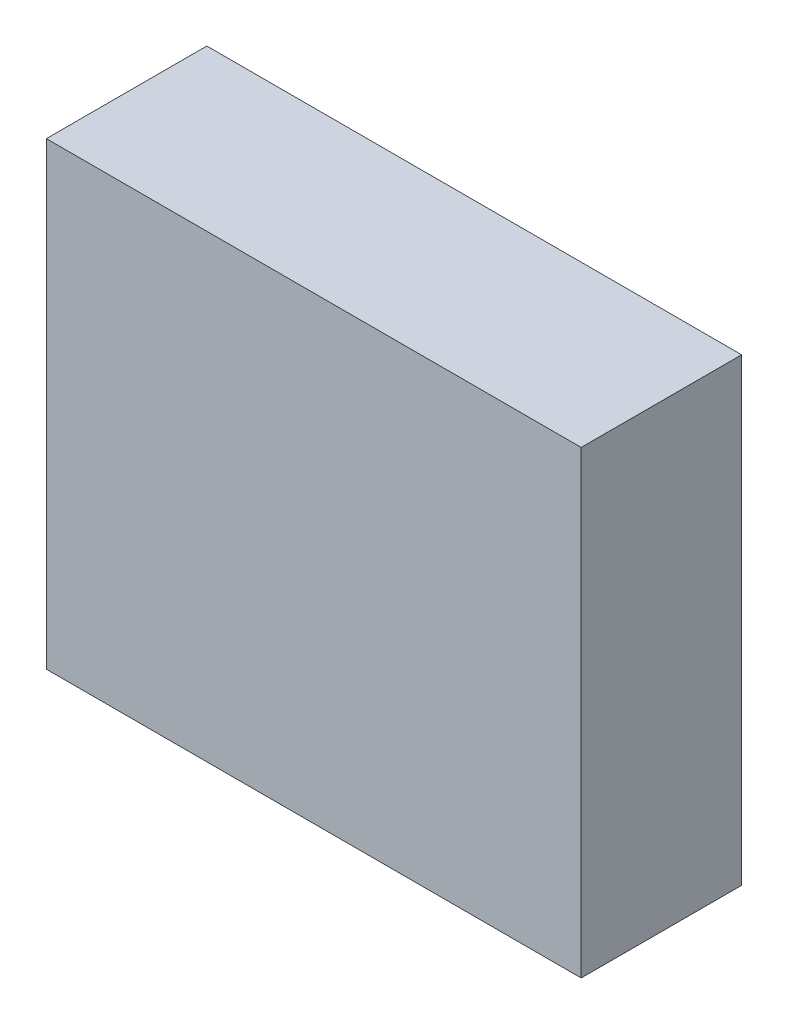
ISO-10303-21;
HEADER;
FILE_DESCRIPTION(('STEP AP214'),'2;1');
FILE_NAME('part.step','',(''),(''),'','','');
FILE_SCHEMA(('AUTOMOTIVE_DESIGN { 1 0 10303 214 1 1 1 1 }'));
ENDSEC;
DATA;
#1=APPLICATION_CONTEXT('core data for automotive mechanical design processes');
#2=APPLICATION_PROTOCOL_DEFINITION('international standard','automotive_design',2000,#1);
#3=PRODUCT_CONTEXT('',#1,'mechanical');
#4=PRODUCT('Part','Part','',(#3));
#5=PRODUCT_RELATED_PRODUCT_CATEGORY('part','',(#4));
#6=PRODUCT_DEFINITION_FORMATION('','',#4);
#7=PRODUCT_DEFINITION_CONTEXT('part definition',#1,'design');
#8=PRODUCT_DEFINITION('design','',#6,#7);
#9=PRODUCT_DEFINITION_SHAPE('','',#8);
#10=(LENGTH_UNIT() NAMED_UNIT(*) SI_UNIT(.MILLI.,.METRE.));
#11=(NAMED_UNIT(*) PLANE_ANGLE_UNIT() SI_UNIT($,.RADIAN.));
#12=(NAMED_UNIT(*) SI_UNIT($,.STERADIAN.) SOLID_ANGLE_UNIT());
#13=UNCERTAINTY_MEASURE_WITH_UNIT(LENGTH_MEASURE(1.E-05),#10,'distance_accuracy_value','');
#14=(GEOMETRIC_REPRESENTATION_CONTEXT(3) GLOBAL_UNCERTAINTY_ASSIGNED_CONTEXT((#13)) GLOBAL_UNIT_ASSIGNED_CONTEXT((#10,
#11,#12)) REPRESENTATION_CONTEXT('',''));
#15=CARTESIAN_POINT('',(0.,0.,0.));
#16=DIRECTION('',(0.,0.,1.));
#17=DIRECTION('',(1.,0.,0.));
#18=AXIS2_PLACEMENT_3D('',#15,#16,#17);
#19=CARTESIAN_POINT('',(3.5500056,-3.0499812,2.1299932));
#20=DIRECTION('',(0.,1.,0.));
#21=DIRECTION('',(0.,0.,1.));
#22=AXIS2_PLACEMENT_3D('',#19,#20,#21);
#23=PLANE('',#22);
#24=DIRECTION('',(1.,0.,0.));
#25=VECTOR('',#24,1.);
#26=CARTESIAN_POINT('',(3.5500056,-3.0499812,0.));
#27=LINE('',#26,#25);
#28=CARTESIAN_POINT('',(-3.5500056,-3.0499812,0.));
#29=VERTEX_POINT('',#28);
#30=CARTESIAN_POINT('',(3.5500056,-3.0499812,0.));
#31=VERTEX_POINT('',#30);
#32=EDGE_CURVE('E95',#29,#31,#27,.T.);
#33=ORIENTED_EDGE('',*,*,#32,.T.);
#34=DIRECTION('',(0.,0.,-1.));
#35=VECTOR('',#34,1.);
#36=CARTESIAN_POINT('',(3.5500056,-3.0499812,2.1299932));
#37=LINE('',#36,#35);
#38=CARTESIAN_POINT('',(3.5500056,-3.0499812,2.1299932));
#39=VERTEX_POINT('',#38);
#40=EDGE_CURVE('E11',#39,#31,#37,.T.);
#41=ORIENTED_EDGE('',*,*,#40,.F.);
#42=DIRECTION('',(1.,0.,0.));
#43=VECTOR('',#42,1.);
#44=CARTESIAN_POINT('',(3.5500056,-3.0499812,2.1299932));
#45=LINE('',#44,#43);
#46=CARTESIAN_POINT('',(-3.5500056,-3.0499812,2.1299932));
#47=VERTEX_POINT('',#46);
#48=EDGE_CURVE('E83',#47,#39,#45,.T.);
#49=ORIENTED_EDGE('',*,*,#48,.F.);
#50=DIRECTION('',(0.,0.,-1.));
#51=VECTOR('',#50,1.);
#52=CARTESIAN_POINT('',(-3.5500056,-3.0499812,2.1299932));
#53=LINE('',#52,#51);
#54=EDGE_CURVE('E91',#47,#29,#53,.T.);
#55=ORIENTED_EDGE('',*,*,#54,.T.);
#56=EDGE_LOOP('',(#33,#41,#49,#55));
#57=FACE_BOUND('',#56,.T.);
#58=ADVANCED_FACE('F32',(#57),#23,.F.);
#59=CARTESIAN_POINT('',(3.5500056,3.0500066,2.1299932));
#60=DIRECTION('',(-1.,0.,0.));
#61=DIRECTION('',(0.,0.,1.));
#62=AXIS2_PLACEMENT_3D('',#59,#60,#61);
#63=PLANE('',#62);
#64=DIRECTION('',(0.,1.,0.));
#65=VECTOR('',#64,1.);
#66=CARTESIAN_POINT('',(3.5500056,3.0500066,0.));
#67=LINE('',#66,#65);
#68=CARTESIAN_POINT('',(3.5500056,3.0500066,0.));
#69=VERTEX_POINT('',#68);
#70=EDGE_CURVE('E87',#31,#69,#67,.T.);
#71=ORIENTED_EDGE('',*,*,#70,.T.);
#72=DIRECTION('',(0.,0.,-1.));
#73=VECTOR('',#72,1.);
#74=CARTESIAN_POINT('',(3.5500056,3.0500066,2.1299932));
#75=LINE('',#74,#73);
#76=CARTESIAN_POINT('',(3.5500056,3.0500066,2.1299932));
#77=VERTEX_POINT('',#76);
#78=EDGE_CURVE('E40',#77,#69,#75,.T.);
#79=ORIENTED_EDGE('',*,*,#78,.F.);
#80=DIRECTION('',(0.,1.,0.));
#81=VECTOR('',#80,1.);
#82=CARTESIAN_POINT('',(3.5500056,3.0500066,2.1299932));
#83=LINE('',#82,#81);
#84=EDGE_CURVE('E78',#39,#77,#83,.T.);
#85=ORIENTED_EDGE('',*,*,#84,.F.);
#86=ORIENTED_EDGE('',*,*,#40,.T.);
#87=EDGE_LOOP('',(#71,#79,#85,#86));
#88=FACE_BOUND('',#87,.T.);
#89=ADVANCED_FACE('F86',(#88),#63,.F.);
#90=CARTESIAN_POINT('',(-3.5500056,3.0500066,2.1299932));
#91=DIRECTION('',(0.,-1.,0.));
#92=DIRECTION('',(0.,0.,-1.));
#93=AXIS2_PLACEMENT_3D('',#90,#91,#92);
#94=PLANE('',#93);
#95=DIRECTION('',(-1.,0.,0.));
#96=VECTOR('',#95,1.);
#97=CARTESIAN_POINT('',(-3.5500056,3.0500066,0.));
#98=LINE('',#97,#96);
#99=CARTESIAN_POINT('',(-3.5500056,3.0500066,0.));
#100=VERTEX_POINT('',#99);
#101=EDGE_CURVE('E65',#69,#100,#98,.T.);
#102=ORIENTED_EDGE('',*,*,#101,.T.);
#103=DIRECTION('',(0.,0.,-1.));
#104=VECTOR('',#103,1.);
#105=CARTESIAN_POINT('',(-3.5500056,3.0500066,2.1299932));
#106=LINE('',#105,#104);
#107=CARTESIAN_POINT('',(-3.5500056,3.0500066,2.1299932));
#108=VERTEX_POINT('',#107);
#109=EDGE_CURVE('E88',#108,#100,#106,.T.);
#110=ORIENTED_EDGE('',*,*,#109,.F.);
#111=DIRECTION('',(-1.,0.,0.));
#112=VECTOR('',#111,1.);
#113=CARTESIAN_POINT('',(-3.5500056,3.0500066,2.1299932));
#114=LINE('',#113,#112);
#115=EDGE_CURVE('E81',#77,#108,#114,.T.);
#116=ORIENTED_EDGE('',*,*,#115,.F.);
#117=ORIENTED_EDGE('',*,*,#78,.T.);
#118=EDGE_LOOP('',(#102,#110,#116,#117));
#119=FACE_BOUND('',#118,.T.);
#120=ADVANCED_FACE('F89',(#119),#94,.F.);
#121=CARTESIAN_POINT('',(-3.5500056,-3.0499812,2.1299932));
#122=DIRECTION('',(1.,0.,0.));
#123=DIRECTION('',(0.,0.,-1.));
#124=AXIS2_PLACEMENT_3D('',#121,#122,#123);
#125=PLANE('',#124);
#126=DIRECTION('',(0.,-1.,0.));
#127=VECTOR('',#126,1.);
#128=CARTESIAN_POINT('',(-3.5500056,-3.0499812,0.));
#129=LINE('',#128,#127);
#130=EDGE_CURVE('E71',#100,#29,#129,.T.);
#131=ORIENTED_EDGE('',*,*,#130,.T.);
#132=ORIENTED_EDGE('',*,*,#54,.F.);
#133=DIRECTION('',(0.,-1.,0.));
#134=VECTOR('',#133,1.);
#135=CARTESIAN_POINT('',(-3.5500056,-3.0499812,2.1299932));
#136=LINE('',#135,#134);
#137=EDGE_CURVE('E48',#108,#47,#136,.T.);
#138=ORIENTED_EDGE('',*,*,#137,.F.);
#139=ORIENTED_EDGE('',*,*,#109,.T.);
#140=EDGE_LOOP('',(#131,#132,#138,#139));
#141=FACE_BOUND('',#140,.T.);
#142=ADVANCED_FACE('F102',(#141),#125,.F.);
#143=CARTESIAN_POINT('',(0.,0.,2.1299932));
#144=DIRECTION('',(0.,0.,-1.));
#145=DIRECTION('',(-1.,0.,0.));
#146=AXIS2_PLACEMENT_3D('',#143,#144,#145);
#147=PLANE('',#146);
#148=ORIENTED_EDGE('',*,*,#48,.T.);
#149=ORIENTED_EDGE('',*,*,#84,.T.);
#150=ORIENTED_EDGE('',*,*,#115,.T.);
#151=ORIENTED_EDGE('',*,*,#137,.T.);
#152=EDGE_LOOP('',(#148,#149,#150,#151));
#153=FACE_BOUND('',#152,.T.);
#154=ADVANCED_FACE('F79',(#153),#147,.F.);
#155=CARTESIAN_POINT('',(0.,0.,0.));
#156=DIRECTION('',(0.,0.,-1.));
#157=DIRECTION('',(-1.,0.,0.));
#158=AXIS2_PLACEMENT_3D('',#155,#156,#157);
#159=PLANE('',#158);
#160=ORIENTED_EDGE('',*,*,#32,.F.);
#161=ORIENTED_EDGE('',*,*,#130,.F.);
#162=ORIENTED_EDGE('',*,*,#101,.F.);
#163=ORIENTED_EDGE('',*,*,#70,.F.);
#164=EDGE_LOOP('',(#160,#161,#162,#163));
#165=FACE_BOUND('',#164,.T.);
#166=ADVANCED_FACE('F105',(#165),#159,.T.);
#167=CLOSED_SHELL('',(#58,#89,#120,#142,#154,#166));
#168=MANIFOLD_SOLID_BREP('B2',#167);
#169=ADVANCED_BREP_SHAPE_REPRESENTATION('',(#18,#168),#14);
#170=SHAPE_DEFINITION_REPRESENTATION(#9,#169);
ENDSEC;
END-ISO-10303-21;
